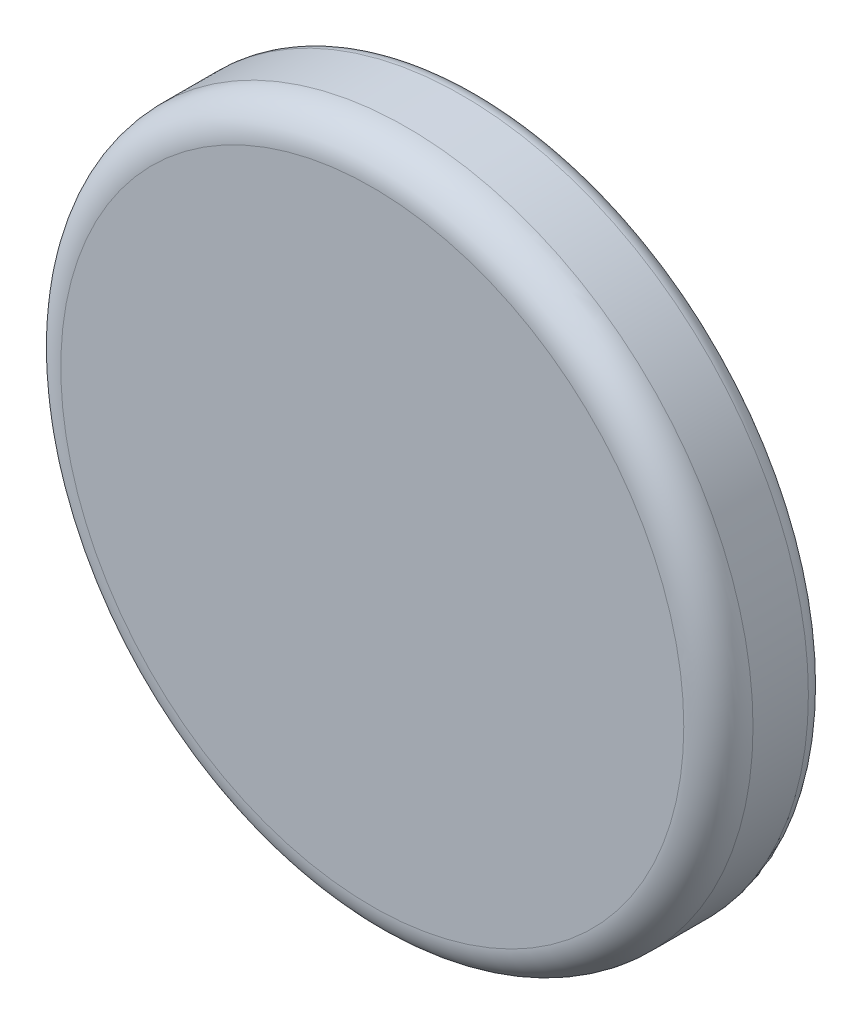
ISO-10303-21;
HEADER;
FILE_DESCRIPTION(('STEP AP214'),'2;1');
FILE_NAME('part.step','',(''),(''),'','','');
FILE_SCHEMA(('AUTOMOTIVE_DESIGN { 1 0 10303 214 1 1 1 1 }'));
ENDSEC;
DATA;
#1=APPLICATION_CONTEXT('core data for automotive mechanical design processes');
#2=APPLICATION_PROTOCOL_DEFINITION('international standard','automotive_design',2000,#1);
#3=PRODUCT_CONTEXT('',#1,'mechanical');
#4=PRODUCT('Part','Part','',(#3));
#5=PRODUCT_RELATED_PRODUCT_CATEGORY('part','',(#4));
#6=PRODUCT_DEFINITION_FORMATION('','',#4);
#7=PRODUCT_DEFINITION_CONTEXT('part definition',#1,'design');
#8=PRODUCT_DEFINITION('design','',#6,#7);
#9=PRODUCT_DEFINITION_SHAPE('','',#8);
#10=(LENGTH_UNIT() NAMED_UNIT(*) SI_UNIT(.MILLI.,.METRE.));
#11=(NAMED_UNIT(*) PLANE_ANGLE_UNIT() SI_UNIT($,.RADIAN.));
#12=(NAMED_UNIT(*) SI_UNIT($,.STERADIAN.) SOLID_ANGLE_UNIT());
#13=UNCERTAINTY_MEASURE_WITH_UNIT(LENGTH_MEASURE(1.E-05),#10,'distance_accuracy_value','');
#14=(GEOMETRIC_REPRESENTATION_CONTEXT(3) GLOBAL_UNCERTAINTY_ASSIGNED_CONTEXT((#13)) GLOBAL_UNIT_ASSIGNED_CONTEXT((#10,
#11,#12)) REPRESENTATION_CONTEXT('',''));
#15=CARTESIAN_POINT('',(0.,0.,0.));
#16=DIRECTION('',(0.,0.,1.));
#17=DIRECTION('',(1.,0.,0.));
#18=AXIS2_PLACEMENT_3D('',#15,#16,#17);
#19=CARTESIAN_POINT('',(0.,0.,-1.6));
#20=DIRECTION('',(0.,0.,1.));
#21=DIRECTION('',(1.,0.,0.));
#22=AXIS2_PLACEMENT_3D('',#19,#20,#21);
#23=TOROIDAL_SURFACE('',#22,9.5,0.5);
#24=CARTESIAN_POINT('',(0.,0.,-1.6));
#25=DIRECTION('',(0.,0.,1.));
#26=DIRECTION('',(1.,0.,0.));
#27=AXIS2_PLACEMENT_3D('',#24,#25,#26);
#28=CIRCLE('',#27,9.);
#29=CARTESIAN_POINT('',(9.,0.,-1.6));
#30=VERTEX_POINT('',#29);
#31=EDGE_CURVE('E274',#30,#30,#28,.F.);
#32=ORIENTED_EDGE('',*,*,#31,.F.);
#33=EDGE_LOOP('',(#32));
#34=FACE_BOUND('',#33,.T.);
#35=CARTESIAN_POINT('',(0.,0.,-2.1));
#36=DIRECTION('',(0.,0.,1.));
#37=DIRECTION('',(1.,0.,0.));
#38=AXIS2_PLACEMENT_3D('',#35,#36,#37);
#39=CIRCLE('',#38,9.5);
#40=CARTESIAN_POINT('',(9.5,0.,-2.1));
#41=VERTEX_POINT('',#40);
#42=EDGE_CURVE('E270',#41,#41,#39,.F.);
#43=ORIENTED_EDGE('',*,*,#42,.T.);
#44=EDGE_LOOP('',(#43));
#45=FACE_BOUND('',#44,.T.);
#46=ADVANCED_FACE('F47',(#34,#45),#23,.T.);
#47=CARTESIAN_POINT('',(0.,0.,-1.6));
#48=DIRECTION('',(0.,0.,1.));
#49=DIRECTION('',(1.,0.,0.));
#50=AXIS2_PLACEMENT_3D('',#47,#48,#49);
#51=TOROIDAL_SURFACE('',#50,9.5,0.5);
#52=CARTESIAN_POINT('',(0.,0.,-1.6));
#53=DIRECTION('',(0.,0.,1.));
#54=DIRECTION('',(1.,0.,0.));
#55=AXIS2_PLACEMENT_3D('',#52,#53,#54);
#56=CIRCLE('',#55,10.);
#57=CARTESIAN_POINT('',(10.,0.,-1.6));
#58=VERTEX_POINT('',#57);
#59=EDGE_CURVE('E266',#58,#58,#56,.T.);
#60=ORIENTED_EDGE('',*,*,#59,.F.);
#61=EDGE_LOOP('',(#60));
#62=FACE_BOUND('',#61,.T.);
#63=ORIENTED_EDGE('',*,*,#42,.F.);
#64=EDGE_LOOP('',(#63));
#65=FACE_BOUND('',#64,.T.);
#66=ADVANCED_FACE('F296',(#62,#65),#51,.T.);
#67=CARTESIAN_POINT('',(0.57030635959388,0.,-2.1));
#68=DIRECTION('',(1.,0.,0.));
#69=DIRECTION('',(0.,0.,-1.));
#70=AXIS2_PLACEMENT_3D('',#67,#68,#69);
#71=PLANE('',#70);
#72=DIRECTION('',(0.,1.,0.));
#73=VECTOR('',#72,1.);
#74=CARTESIAN_POINT('',(0.57030635959388,0.,0.));
#75=LINE('',#74,#73);
#76=CARTESIAN_POINT('',(0.57030635959388,0.535854495539692,0.));
#77=VERTEX_POINT('',#76);
#78=CARTESIAN_POINT('',(0.57030635959388,2.2,0.));
#79=VERTEX_POINT('',#78);
#80=EDGE_CURVE('E178',#77,#79,#75,.T.);
#81=ORIENTED_EDGE('',*,*,#80,.T.);
#82=DIRECTION('',(0.,0.,1.));
#83=VECTOR('',#82,1.);
#84=CARTESIAN_POINT('',(0.57030635959388,2.2,-2.1));
#85=LINE('',#84,#83);
#86=CARTESIAN_POINT('',(0.57030635959388,2.2,-2.1));
#87=VERTEX_POINT('',#86);
#88=EDGE_CURVE('E224',#87,#79,#85,.T.);
#89=ORIENTED_EDGE('',*,*,#88,.F.);
#90=DIRECTION('',(0.,1.,0.));
#91=VECTOR('',#90,1.);
#92=CARTESIAN_POINT('',(0.57030635959388,0.,-2.1));
#93=LINE('',#92,#91);
#94=CARTESIAN_POINT('',(0.57030635959388,0.535854495539692,-2.1));
#95=VERTEX_POINT('',#94);
#96=EDGE_CURVE('E65',#95,#87,#93,.T.);
#97=ORIENTED_EDGE('',*,*,#96,.F.);
#98=DIRECTION('',(0.,0.,1.));
#99=VECTOR('',#98,1.);
#100=CARTESIAN_POINT('',(0.57030635959388,0.535854495539692,-2.1));
#101=LINE('',#100,#99);
#102=EDGE_CURVE('E119',#95,#77,#101,.T.);
#103=ORIENTED_EDGE('',*,*,#102,.T.);
#104=EDGE_LOOP('',(#81,#89,#97,#103));
#105=FACE_BOUND('',#104,.T.);
#106=ADVANCED_FACE('F303',(#105),#71,.F.);
#107=CARTESIAN_POINT('',(0.,2.2,-2.1));
#108=DIRECTION('',(0.,-1.,0.));
#109=DIRECTION('',(0.,0.,-1.));
#110=AXIS2_PLACEMENT_3D('',#107,#108,#109);
#111=PLANE('',#110);
#112=DIRECTION('',(1.,0.,0.));
#113=VECTOR('',#112,1.);
#114=CARTESIAN_POINT('',(0.,2.2,0.));
#115=LINE('',#114,#113);
#116=CARTESIAN_POINT('',(-0.57030635959388,2.2,0.));
#117=VERTEX_POINT('',#116);
#118=EDGE_CURVE('E216',#117,#79,#115,.T.);
#119=ORIENTED_EDGE('',*,*,#118,.F.);
#120=DIRECTION('',(0.,0.,1.));
#121=VECTOR('',#120,1.);
#122=CARTESIAN_POINT('',(-0.57030635959388,2.2,-2.1));
#123=LINE('',#122,#121);
#124=CARTESIAN_POINT('',(-0.57030635959388,2.2,-2.1));
#125=VERTEX_POINT('',#124);
#126=EDGE_CURVE('E111',#125,#117,#123,.T.);
#127=ORIENTED_EDGE('',*,*,#126,.F.);
#128=DIRECTION('',(1.,0.,0.));
#129=VECTOR('',#128,1.);
#130=CARTESIAN_POINT('',(0.,2.2,-2.1));
#131=LINE('',#130,#129);
#132=EDGE_CURVE('E160',#125,#87,#131,.T.);
#133=ORIENTED_EDGE('',*,*,#132,.T.);
#134=ORIENTED_EDGE('',*,*,#88,.T.);
#135=EDGE_LOOP('',(#119,#127,#133,#134));
#136=FACE_BOUND('',#135,.T.);
#137=ADVANCED_FACE('F311',(#136),#111,.T.);
#138=CARTESIAN_POINT('',(-0.57030635959388,0.,-2.1));
#139=DIRECTION('',(1.,0.,0.));
#140=DIRECTION('',(0.,1.,0.));
#141=AXIS2_PLACEMENT_3D('',#138,#139,#140);
#142=PLANE('',#141);
#143=DIRECTION('',(0.,1.,0.));
#144=VECTOR('',#143,1.);
#145=CARTESIAN_POINT('',(-0.57030635959388,0.,0.));
#146=LINE('',#145,#144);
#147=CARTESIAN_POINT('',(-0.57030635959388,0.535854495539692,0.));
#148=VERTEX_POINT('',#147);
#149=EDGE_CURVE('E148',#148,#117,#146,.T.);
#150=ORIENTED_EDGE('',*,*,#149,.F.);
#151=DIRECTION('',(0.,0.,1.));
#152=VECTOR('',#151,1.);
#153=CARTESIAN_POINT('',(-0.57030635959388,0.535854495539692,-2.1));
#154=LINE('',#153,#152);
#155=CARTESIAN_POINT('',(-0.57030635959388,0.535854495539692,-2.1));
#156=VERTEX_POINT('',#155);
#157=EDGE_CURVE('E105',#156,#148,#154,.T.);
#158=ORIENTED_EDGE('',*,*,#157,.F.);
#159=DIRECTION('',(0.,1.,0.));
#160=VECTOR('',#159,1.);
#161=CARTESIAN_POINT('',(-0.57030635959388,0.,-2.1));
#162=LINE('',#161,#160);
#163=EDGE_CURVE('E146',#156,#125,#162,.T.);
#164=ORIENTED_EDGE('',*,*,#163,.T.);
#165=ORIENTED_EDGE('',*,*,#126,.T.);
#166=EDGE_LOOP('',(#150,#158,#164,#165));
#167=FACE_BOUND('',#166,.T.);
#168=ADVANCED_FACE('F145',(#167),#142,.T.);
#169=CARTESIAN_POINT('',(0.,0.535854495539692,-2.1));
#170=DIRECTION('',(0.,-1.,0.));
#171=DIRECTION('',(0.,0.,-1.));
#172=AXIS2_PLACEMENT_3D('',#169,#170,#171);
#173=PLANE('',#172);
#174=DIRECTION('',(1.,0.,0.));
#175=VECTOR('',#174,1.);
#176=CARTESIAN_POINT('',(0.,0.535854495539692,0.));
#177=LINE('',#176,#175);
#178=CARTESIAN_POINT('',(-2.2,0.535854495539692,0.));
#179=VERTEX_POINT('',#178);
#180=EDGE_CURVE('E211',#179,#148,#177,.T.);
#181=ORIENTED_EDGE('',*,*,#180,.F.);
#182=DIRECTION('',(0.,0.,1.));
#183=VECTOR('',#182,1.);
#184=CARTESIAN_POINT('',(-2.2,0.535854495539692,-2.1));
#185=LINE('',#184,#183);
#186=CARTESIAN_POINT('',(-2.2,0.535854495539692,-2.1));
#187=VERTEX_POINT('',#186);
#188=EDGE_CURVE('E151',#187,#179,#185,.T.);
#189=ORIENTED_EDGE('',*,*,#188,.F.);
#190=DIRECTION('',(1.,0.,0.));
#191=VECTOR('',#190,1.);
#192=CARTESIAN_POINT('',(0.,0.535854495539692,-2.1));
#193=LINE('',#192,#191);
#194=EDGE_CURVE('E157',#187,#156,#193,.T.);
#195=ORIENTED_EDGE('',*,*,#194,.T.);
#196=ORIENTED_EDGE('',*,*,#157,.T.);
#197=EDGE_LOOP('',(#181,#189,#195,#196));
#198=FACE_BOUND('',#197,.T.);
#199=ADVANCED_FACE('F163',(#198),#173,.T.);
#200=CARTESIAN_POINT('',(-2.2,0.,-2.1));
#201=DIRECTION('',(1.,0.,0.));
#202=DIRECTION('',(0.,0.,-1.));
#203=AXIS2_PLACEMENT_3D('',#200,#201,#202);
#204=PLANE('',#203);
#205=DIRECTION('',(0.,1.,0.));
#206=VECTOR('',#205,1.);
#207=CARTESIAN_POINT('',(-2.2,0.,0.));
#208=LINE('',#207,#206);
#209=CARTESIAN_POINT('',(-2.2,-0.535854495539692,0.));
#210=VERTEX_POINT('',#209);
#211=EDGE_CURVE('E207',#210,#179,#208,.T.);
#212=ORIENTED_EDGE('',*,*,#211,.F.);
#213=DIRECTION('',(0.,0.,1.));
#214=VECTOR('',#213,1.);
#215=CARTESIAN_POINT('',(-2.2,-0.535854495539692,-2.1));
#216=LINE('',#215,#214);
#217=CARTESIAN_POINT('',(-2.2,-0.535854495539692,-2.1));
#218=VERTEX_POINT('',#217);
#219=EDGE_CURVE('E233',#218,#210,#216,.T.);
#220=ORIENTED_EDGE('',*,*,#219,.F.);
#221=DIRECTION('',(0.,1.,0.));
#222=VECTOR('',#221,1.);
#223=CARTESIAN_POINT('',(-2.2,0.,-2.1));
#224=LINE('',#223,#222);
#225=EDGE_CURVE('E165',#218,#187,#224,.T.);
#226=ORIENTED_EDGE('',*,*,#225,.T.);
#227=ORIENTED_EDGE('',*,*,#188,.T.);
#228=EDGE_LOOP('',(#212,#220,#226,#227));
#229=FACE_BOUND('',#228,.T.);
#230=ADVANCED_FACE('F340',(#229),#204,.T.);
#231=CARTESIAN_POINT('',(0.,-0.535854495539692,-2.1));
#232=DIRECTION('',(0.,-1.,0.));
#233=DIRECTION('',(1.,0.,0.));
#234=AXIS2_PLACEMENT_3D('',#231,#232,#233);
#235=PLANE('',#234);
#236=DIRECTION('',(1.,0.,0.));
#237=VECTOR('',#236,1.);
#238=CARTESIAN_POINT('',(0.,-0.535854495539692,0.));
#239=LINE('',#238,#237);
#240=CARTESIAN_POINT('',(-0.57030635959388,-0.535854495539692,0.));
#241=VERTEX_POINT('',#240);
#242=EDGE_CURVE('E203',#210,#241,#239,.T.);
#243=ORIENTED_EDGE('',*,*,#242,.T.);
#244=DIRECTION('',(0.,0.,1.));
#245=VECTOR('',#244,1.);
#246=CARTESIAN_POINT('',(-0.57030635959388,-0.535854495539692,-2.1));
#247=LINE('',#246,#245);
#248=CARTESIAN_POINT('',(-0.57030635959388,-0.535854495539692,-2.1));
#249=VERTEX_POINT('',#248);
#250=EDGE_CURVE('E236',#249,#241,#247,.T.);
#251=ORIENTED_EDGE('',*,*,#250,.F.);
#252=DIRECTION('',(1.,0.,0.));
#253=VECTOR('',#252,1.);
#254=CARTESIAN_POINT('',(0.,-0.535854495539692,-2.1));
#255=LINE('',#254,#253);
#256=EDGE_CURVE('E168',#218,#249,#255,.T.);
#257=ORIENTED_EDGE('',*,*,#256,.F.);
#258=ORIENTED_EDGE('',*,*,#219,.T.);
#259=EDGE_LOOP('',(#243,#251,#257,#258));
#260=FACE_BOUND('',#259,.T.);
#261=ADVANCED_FACE('F336',(#260),#235,.F.);
#262=CARTESIAN_POINT('',(-0.57030635959388,0.,-2.1));
#263=DIRECTION('',(1.,0.,0.));
#264=DIRECTION('',(0.,0.,-1.));
#265=AXIS2_PLACEMENT_3D('',#262,#263,#264);
#266=PLANE('',#265);
#267=DIRECTION('',(0.,1.,0.));
#268=VECTOR('',#267,1.);
#269=CARTESIAN_POINT('',(-0.57030635959388,0.,0.));
#270=LINE('',#269,#268);
#271=CARTESIAN_POINT('',(-0.57030635959388,-2.2,0.));
#272=VERTEX_POINT('',#271);
#273=EDGE_CURVE('E199',#272,#241,#270,.T.);
#274=ORIENTED_EDGE('',*,*,#273,.F.);
#275=DIRECTION('',(0.,0.,1.));
#276=VECTOR('',#275,1.);
#277=CARTESIAN_POINT('',(-0.57030635959388,-2.2,-2.1));
#278=LINE('',#277,#276);
#279=CARTESIAN_POINT('',(-0.57030635959388,-2.2,-2.1));
#280=VERTEX_POINT('',#279);
#281=EDGE_CURVE('E239',#280,#272,#278,.T.);
#282=ORIENTED_EDGE('',*,*,#281,.F.);
#283=DIRECTION('',(0.,1.,0.));
#284=VECTOR('',#283,1.);
#285=CARTESIAN_POINT('',(-0.57030635959388,0.,-2.1));
#286=LINE('',#285,#284);
#287=EDGE_CURVE('E533',#280,#249,#286,.T.);
#288=ORIENTED_EDGE('',*,*,#287,.T.);
#289=ORIENTED_EDGE('',*,*,#250,.T.);
#290=EDGE_LOOP('',(#274,#282,#288,#289));
#291=FACE_BOUND('',#290,.T.);
#292=ADVANCED_FACE('F332',(#291),#266,.T.);
#293=CARTESIAN_POINT('',(0.,-2.2,-2.1));
#294=DIRECTION('',(0.,-1.,0.));
#295=DIRECTION('',(0.,0.,-1.));
#296=AXIS2_PLACEMENT_3D('',#293,#294,#295);
#297=PLANE('',#296);
#298=DIRECTION('',(1.,0.,0.));
#299=VECTOR('',#298,1.);
#300=CARTESIAN_POINT('',(0.,-2.2,0.));
#301=LINE('',#300,#299);
#302=CARTESIAN_POINT('',(0.57030635959388,-2.2,0.));
#303=VERTEX_POINT('',#302);
#304=EDGE_CURVE('E196',#272,#303,#301,.T.);
#305=ORIENTED_EDGE('',*,*,#304,.T.);
#306=DIRECTION('',(0.,0.,1.));
#307=VECTOR('',#306,1.);
#308=CARTESIAN_POINT('',(0.57030635959388,-2.2,-2.1));
#309=LINE('',#308,#307);
#310=CARTESIAN_POINT('',(0.57030635959388,-2.2,-2.1));
#311=VERTEX_POINT('',#310);
#312=EDGE_CURVE('E242',#311,#303,#309,.T.);
#313=ORIENTED_EDGE('',*,*,#312,.F.);
#314=DIRECTION('',(1.,0.,0.));
#315=VECTOR('',#314,1.);
#316=CARTESIAN_POINT('',(0.,-2.2,-2.1));
#317=LINE('',#316,#315);
#318=EDGE_CURVE('E538',#280,#311,#317,.T.);
#319=ORIENTED_EDGE('',*,*,#318,.F.);
#320=ORIENTED_EDGE('',*,*,#281,.T.);
#321=EDGE_LOOP('',(#305,#313,#319,#320));
#322=FACE_BOUND('',#321,.T.);
#323=ADVANCED_FACE('F328',(#322),#297,.F.);
#324=CARTESIAN_POINT('',(0.57030635959388,0.,-2.1));
#325=DIRECTION('',(1.,0.,0.));
#326=DIRECTION('',(0.,0.,-1.));
#327=AXIS2_PLACEMENT_3D('',#324,#325,#326);
#328=PLANE('',#327);
#329=DIRECTION('',(0.,1.,0.));
#330=VECTOR('',#329,1.);
#331=CARTESIAN_POINT('',(0.57030635959388,0.,0.));
#332=LINE('',#331,#330);
#333=CARTESIAN_POINT('',(0.57030635959388,-0.535854495539692,0.));
#334=VERTEX_POINT('',#333);
#335=EDGE_CURVE('E193',#303,#334,#332,.T.);
#336=ORIENTED_EDGE('',*,*,#335,.T.);
#337=DIRECTION('',(0.,0.,1.));
#338=VECTOR('',#337,1.);
#339=CARTESIAN_POINT('',(0.57030635959388,-0.535854495539692,-2.1));
#340=LINE('',#339,#338);
#341=CARTESIAN_POINT('',(0.57030635959388,-0.535854495539692,-2.1));
#342=VERTEX_POINT('',#341);
#343=EDGE_CURVE('E246',#342,#334,#340,.T.);
#344=ORIENTED_EDGE('',*,*,#343,.F.);
#345=DIRECTION('',(0.,1.,0.));
#346=VECTOR('',#345,1.);
#347=CARTESIAN_POINT('',(0.57030635959388,0.,-2.1));
#348=LINE('',#347,#346);
#349=EDGE_CURVE('E541',#311,#342,#348,.T.);
#350=ORIENTED_EDGE('',*,*,#349,.F.);
#351=ORIENTED_EDGE('',*,*,#312,.T.);
#352=EDGE_LOOP('',(#336,#344,#350,#351));
#353=FACE_BOUND('',#352,.T.);
#354=ADVANCED_FACE('F324',(#353),#328,.F.);
#355=CARTESIAN_POINT('',(0.,-0.535854495539692,-2.1));
#356=DIRECTION('',(0.,-1.,0.));
#357=DIRECTION('',(0.,0.,-1.));
#358=AXIS2_PLACEMENT_3D('',#355,#356,#357);
#359=PLANE('',#358);
#360=DIRECTION('',(1.,0.,0.));
#361=VECTOR('',#360,1.);
#362=CARTESIAN_POINT('',(0.,-0.535854495539692,0.));
#363=LINE('',#362,#361);
#364=CARTESIAN_POINT('',(2.2,-0.535854495539692,0.));
#365=VERTEX_POINT('',#364);
#366=EDGE_CURVE('E190',#334,#365,#363,.T.);
#367=ORIENTED_EDGE('',*,*,#366,.T.);
#368=DIRECTION('',(0.,0.,1.));
#369=VECTOR('',#368,1.);
#370=CARTESIAN_POINT('',(2.2,-0.535854495539692,-2.1));
#371=LINE('',#370,#369);
#372=CARTESIAN_POINT('',(2.2,-0.535854495539692,-2.1));
#373=VERTEX_POINT('',#372);
#374=EDGE_CURVE('E250',#373,#365,#371,.T.);
#375=ORIENTED_EDGE('',*,*,#374,.F.);
#376=DIRECTION('',(1.,0.,0.));
#377=VECTOR('',#376,1.);
#378=CARTESIAN_POINT('',(0.,-0.535854495539692,-2.1));
#379=LINE('',#378,#377);
#380=EDGE_CURVE('E546',#342,#373,#379,.T.);
#381=ORIENTED_EDGE('',*,*,#380,.F.);
#382=ORIENTED_EDGE('',*,*,#343,.T.);
#383=EDGE_LOOP('',(#367,#375,#381,#382));
#384=FACE_BOUND('',#383,.T.);
#385=ADVANCED_FACE('F320',(#384),#359,.F.);
#386=CARTESIAN_POINT('',(2.2,0.,-2.1));
#387=DIRECTION('',(1.,0.,0.));
#388=DIRECTION('',(0.,0.,-1.));
#389=AXIS2_PLACEMENT_3D('',#386,#387,#388);
#390=PLANE('',#389);
#391=DIRECTION('',(0.,1.,0.));
#392=VECTOR('',#391,1.);
#393=CARTESIAN_POINT('',(2.2,0.,0.));
#394=LINE('',#393,#392);
#395=CARTESIAN_POINT('',(2.2,0.535854495539692,0.));
#396=VERTEX_POINT('',#395);
#397=EDGE_CURVE('E186',#365,#396,#394,.T.);
#398=ORIENTED_EDGE('',*,*,#397,.T.);
#399=DIRECTION('',(0.,0.,1.));
#400=VECTOR('',#399,1.);
#401=CARTESIAN_POINT('',(2.2,0.535854495539692,-2.1));
#402=LINE('',#401,#400);
#403=CARTESIAN_POINT('',(2.2,0.535854495539692,-2.1));
#404=VERTEX_POINT('',#403);
#405=EDGE_CURVE('E254',#404,#396,#402,.T.);
#406=ORIENTED_EDGE('',*,*,#405,.F.);
#407=DIRECTION('',(0.,1.,0.));
#408=VECTOR('',#407,1.);
#409=CARTESIAN_POINT('',(2.2,0.,-2.1));
#410=LINE('',#409,#408);
#411=EDGE_CURVE('E549',#373,#404,#410,.T.);
#412=ORIENTED_EDGE('',*,*,#411,.F.);
#413=ORIENTED_EDGE('',*,*,#374,.T.);
#414=EDGE_LOOP('',(#398,#406,#412,#413));
#415=FACE_BOUND('',#414,.T.);
#416=ADVANCED_FACE('F317',(#415),#390,.F.);
#417=CARTESIAN_POINT('',(0.,0.535854495539692,-2.1));
#418=DIRECTION('',(0.,-1.,0.));
#419=DIRECTION('',(0.,0.,-1.));
#420=AXIS2_PLACEMENT_3D('',#417,#418,#419);
#421=PLANE('',#420);
#422=DIRECTION('',(1.,0.,0.));
#423=VECTOR('',#422,1.);
#424=CARTESIAN_POINT('',(0.,0.535854495539692,0.));
#425=LINE('',#424,#423);
#426=EDGE_CURVE('E182',#77,#396,#425,.T.);
#427=ORIENTED_EDGE('',*,*,#426,.F.);
#428=ORIENTED_EDGE('',*,*,#102,.F.);
#429=DIRECTION('',(1.,0.,0.));
#430=VECTOR('',#429,1.);
#431=CARTESIAN_POINT('',(0.,0.535854495539692,-2.1));
#432=LINE('',#431,#430);
#433=EDGE_CURVE('E552',#95,#404,#432,.T.);
#434=ORIENTED_EDGE('',*,*,#433,.T.);
#435=ORIENTED_EDGE('',*,*,#405,.T.);
#436=EDGE_LOOP('',(#427,#428,#434,#435));
#437=FACE_BOUND('',#436,.T.);
#438=ADVANCED_FACE('F313',(#437),#421,.T.);
#439=CARTESIAN_POINT('',(0.,0.,-2.1));
#440=DIRECTION('',(0.,0.,1.));
#441=DIRECTION('',(1.,0.,0.));
#442=AXIS2_PLACEMENT_3D('',#439,#440,#441);
#443=CYLINDRICAL_SURFACE('',#442,2.5);
#444=CARTESIAN_POINT('',(0.,0.,-2.1));
#445=DIRECTION('',(0.,0.,1.));
#446=DIRECTION('',(1.,0.,0.));
#447=AXIS2_PLACEMENT_3D('',#444,#445,#446);
#448=CIRCLE('',#447,2.5);
#449=CARTESIAN_POINT('',(2.5,0.,-2.1));
#450=VERTEX_POINT('',#449);
#451=EDGE_CURVE('E174',#450,#450,#448,.T.);
#452=ORIENTED_EDGE('',*,*,#451,.T.);
#453=EDGE_LOOP('',(#452));
#454=FACE_BOUND('',#453,.T.);
#455=CARTESIAN_POINT('',(0.,0.,0.));
#456=DIRECTION('',(0.,0.,1.));
#457=DIRECTION('',(1.,0.,0.));
#458=AXIS2_PLACEMENT_3D('',#455,#456,#457);
#459=CIRCLE('',#458,2.5);
#460=CARTESIAN_POINT('',(2.5,0.,0.));
#461=VERTEX_POINT('',#460);
#462=EDGE_CURVE('E220',#461,#461,#459,.T.);
#463=ORIENTED_EDGE('',*,*,#462,.F.);
#464=EDGE_LOOP('',(#463));
#465=FACE_BOUND('',#464,.T.);
#466=ADVANCED_FACE('F316',(#454,#465),#443,.T.);
#467=CARTESIAN_POINT('',(0.,0.,-2.1));
#468=DIRECTION('',(0.,0.,1.));
#469=DIRECTION('',(1.,0.,0.));
#470=AXIS2_PLACEMENT_3D('',#467,#468,#469);
#471=PLANE('',#470);
#472=ORIENTED_EDGE('',*,*,#96,.T.);
#473=ORIENTED_EDGE('',*,*,#132,.F.);
#474=ORIENTED_EDGE('',*,*,#163,.F.);
#475=ORIENTED_EDGE('',*,*,#194,.F.);
#476=ORIENTED_EDGE('',*,*,#225,.F.);
#477=ORIENTED_EDGE('',*,*,#256,.T.);
#478=ORIENTED_EDGE('',*,*,#287,.F.);
#479=ORIENTED_EDGE('',*,*,#318,.T.);
#480=ORIENTED_EDGE('',*,*,#349,.T.);
#481=ORIENTED_EDGE('',*,*,#380,.T.);
#482=ORIENTED_EDGE('',*,*,#411,.T.);
#483=ORIENTED_EDGE('',*,*,#433,.F.);
#484=EDGE_LOOP('',(#472,#473,#474,#475,#476,#477,#478,#479,#480,#481,#482,#483));
#485=FACE_BOUND('',#484,.T.);
#486=ORIENTED_EDGE('',*,*,#451,.F.);
#487=EDGE_LOOP('',(#486));
#488=FACE_BOUND('',#487,.T.);
#489=ADVANCED_FACE('F154',(#485,#488),#471,.F.);
#490=CARTESIAN_POINT('',(0.,0.,0.));
#491=DIRECTION('',(0.,0.,1.));
#492=DIRECTION('',(1.,0.,0.));
#493=AXIS2_PLACEMENT_3D('',#490,#491,#492);
#494=PLANE('',#493);
#495=CARTESIAN_POINT('',(0.,0.,0.));
#496=DIRECTION('',(0.,0.,1.));
#497=DIRECTION('',(1.,0.,0.));
#498=AXIS2_PLACEMENT_3D('',#495,#496,#497);
#499=CIRCLE('',#498,8.);
#500=CARTESIAN_POINT('',(8.,0.,0.));
#501=VERTEX_POINT('',#500);
#502=EDGE_CURVE('E11',#501,#501,#499,.F.);
#503=ORIENTED_EDGE('',*,*,#502,.T.);
#504=EDGE_LOOP('',(#503));
#505=FACE_BOUND('',#504,.T.);
#506=ORIENTED_EDGE('',*,*,#462,.T.);
#507=EDGE_LOOP('',(#506));
#508=FACE_BOUND('',#507,.T.);
#509=ADVANCED_FACE('F357',(#505,#508),#494,.F.);
#510=ORIENTED_EDGE('',*,*,#80,.F.);
#511=ORIENTED_EDGE('',*,*,#426,.T.);
#512=ORIENTED_EDGE('',*,*,#397,.F.);
#513=ORIENTED_EDGE('',*,*,#366,.F.);
#514=ORIENTED_EDGE('',*,*,#335,.F.);
#515=ORIENTED_EDGE('',*,*,#304,.F.);
#516=ORIENTED_EDGE('',*,*,#273,.T.);
#517=ORIENTED_EDGE('',*,*,#242,.F.);
#518=ORIENTED_EDGE('',*,*,#211,.T.);
#519=ORIENTED_EDGE('',*,*,#180,.T.);
#520=ORIENTED_EDGE('',*,*,#149,.T.);
#521=ORIENTED_EDGE('',*,*,#118,.T.);
#522=EDGE_LOOP('',(#510,#511,#512,#513,#514,#515,#516,#517,#518,#519,#520,#521));
#523=FACE_BOUND('',#522,.T.);
#524=ADVANCED_FACE('F359',(#523),#494,.F.);
#525=CARTESIAN_POINT('',(0.,0.,-2.1));
#526=DIRECTION('',(0.,0.,1.));
#527=DIRECTION('',(1.,0.,0.));
#528=AXIS2_PLACEMENT_3D('',#525,#526,#527);
#529=CYLINDRICAL_SURFACE('',#528,9.);
#530=CARTESIAN_POINT('',(0.,0.,-1.));
#531=DIRECTION('',(0.,0.,1.));
#532=DIRECTION('',(1.,0.,0.));
#533=AXIS2_PLACEMENT_3D('',#530,#531,#532);
#534=CIRCLE('',#533,9.);
#535=CARTESIAN_POINT('',(9.,0.,-1.));
#536=VERTEX_POINT('',#535);
#537=EDGE_CURVE('E57',#536,#536,#534,.T.);
#538=ORIENTED_EDGE('',*,*,#537,.T.);
#539=EDGE_LOOP('',(#538));
#540=FACE_BOUND('',#539,.T.);
#541=ORIENTED_EDGE('',*,*,#31,.T.);
#542=EDGE_LOOP('',(#541));
#543=FACE_BOUND('',#542,.T.);
#544=ADVANCED_FACE('F281',(#540,#543),#529,.F.);
#545=CARTESIAN_POINT('',(0.,0.,-2.1));
#546=DIRECTION('',(0.,0.,1.));
#547=DIRECTION('',(1.,0.,0.));
#548=AXIS2_PLACEMENT_3D('',#545,#546,#547);
#549=CYLINDRICAL_SURFACE('',#548,10.);
#550=ORIENTED_EDGE('',*,*,#59,.T.);
#551=EDGE_LOOP('',(#550));
#552=FACE_BOUND('',#551,.T.);
#553=CARTESIAN_POINT('',(0.,0.,0.));
#554=DIRECTION('',(0.,0.,1.));
#555=DIRECTION('',(1.,0.,0.));
#556=AXIS2_PLACEMENT_3D('',#553,#554,#555);
#557=CIRCLE('',#556,10.);
#558=CARTESIAN_POINT('',(10.,0.,0.));
#559=VERTEX_POINT('',#558);
#560=EDGE_CURVE('E262',#559,#559,#557,.F.);
#561=ORIENTED_EDGE('',*,*,#560,.T.);
#562=EDGE_LOOP('',(#561));
#563=FACE_BOUND('',#562,.T.);
#564=ADVANCED_FACE('F363',(#552,#563),#549,.T.);
#565=CARTESIAN_POINT('',(0.,0.,1.));
#566=DIRECTION('',(0.,0.,1.));
#567=DIRECTION('',(1.,0.,0.));
#568=AXIS2_PLACEMENT_3D('',#565,#566,#567);
#569=PLANE('',#568);
#570=CARTESIAN_POINT('',(0.,0.,1.));
#571=DIRECTION('',(0.,0.,1.));
#572=DIRECTION('',(1.,0.,0.));
#573=AXIS2_PLACEMENT_3D('',#570,#571,#572);
#574=CIRCLE('',#573,9.);
#575=CARTESIAN_POINT('',(9.,0.,1.));
#576=VERTEX_POINT('',#575);
#577=EDGE_CURVE('E228',#576,#576,#574,.T.);
#578=ORIENTED_EDGE('',*,*,#577,.T.);
#579=EDGE_LOOP('',(#578));
#580=FACE_BOUND('',#579,.T.);
#581=ADVANCED_FACE('F291',(#580),#569,.T.);
#582=CARTESIAN_POINT('',(0.,0.,0.));
#583=DIRECTION('',(0.,0.,1.));
#584=DIRECTION('',(1.,0.,0.));
#585=AXIS2_PLACEMENT_3D('',#582,#583,#584);
#586=TOROIDAL_SURFACE('',#585,9.,1.);
#587=ORIENTED_EDGE('',*,*,#560,.F.);
#588=EDGE_LOOP('',(#587));
#589=FACE_BOUND('',#588,.T.);
#590=ORIENTED_EDGE('',*,*,#577,.F.);
#591=EDGE_LOOP('',(#590));
#592=FACE_BOUND('',#591,.T.);
#593=ADVANCED_FACE('F285',(#589,#592),#586,.T.);
#594=CARTESIAN_POINT('',(0.,0.,-1.));
#595=DIRECTION('',(0.,0.,1.));
#596=DIRECTION('',(1.,0.,0.));
#597=AXIS2_PLACEMENT_3D('',#594,#595,#596);
#598=TOROIDAL_SURFACE('',#597,8.,1.);
#599=ORIENTED_EDGE('',*,*,#502,.F.);
#600=EDGE_LOOP('',(#599));
#601=FACE_BOUND('',#600,.T.);
#602=ORIENTED_EDGE('',*,*,#537,.F.);
#603=EDGE_LOOP('',(#602));
#604=FACE_BOUND('',#603,.T.);
#605=ADVANCED_FACE('F49',(#601,#604),#598,.F.);
#606=CLOSED_SHELL('',(#46,#66,#106,#137,#168,#199,#230,#261,#292,#323,#354,#385,#416,#438,#466,
#489,#509,#524,#544,#564,#581,#593,#605));
#607=MANIFOLD_SOLID_BREP('B2',#606);
#608=ADVANCED_BREP_SHAPE_REPRESENTATION('',(#18,#607),#14);
#609=SHAPE_DEFINITION_REPRESENTATION(#9,#608);
ENDSEC;
END-ISO-10303-21;
